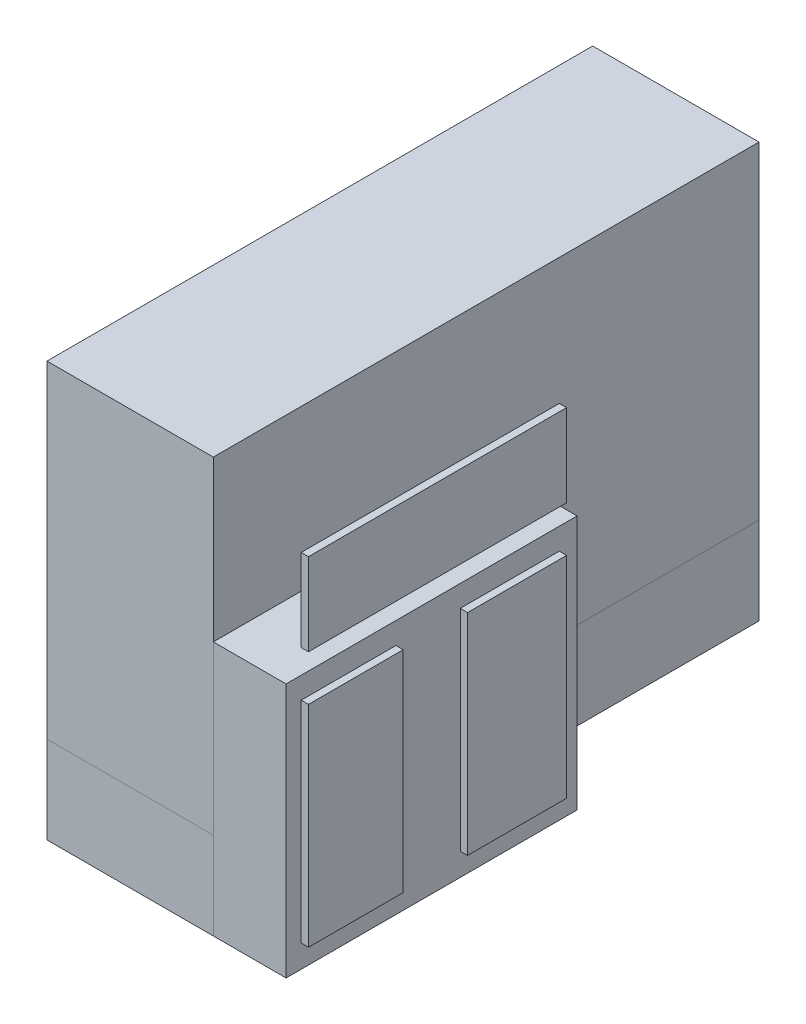
ISO-10303-21;
HEADER;
FILE_DESCRIPTION(('STEP AP214'),'2;1');
FILE_NAME('part.step','',(''),(''),'','','');
FILE_SCHEMA(('AUTOMOTIVE_DESIGN { 1 0 10303 214 1 1 1 1 }'));
ENDSEC;
DATA;
#1=APPLICATION_CONTEXT('core data for automotive mechanical design processes');
#2=APPLICATION_PROTOCOL_DEFINITION('international standard','automotive_design',2000,#1);
#3=PRODUCT_CONTEXT('',#1,'mechanical');
#4=PRODUCT('Part','Part','',(#3));
#5=PRODUCT_RELATED_PRODUCT_CATEGORY('part','',(#4));
#6=PRODUCT_DEFINITION_FORMATION('','',#4);
#7=PRODUCT_DEFINITION_CONTEXT('part definition',#1,'design');
#8=PRODUCT_DEFINITION('design','',#6,#7);
#9=PRODUCT_DEFINITION_SHAPE('','',#8);
#10=(LENGTH_UNIT() NAMED_UNIT(*) SI_UNIT(.MILLI.,.METRE.));
#11=(NAMED_UNIT(*) PLANE_ANGLE_UNIT() SI_UNIT($,.RADIAN.));
#12=(NAMED_UNIT(*) SI_UNIT($,.STERADIAN.) SOLID_ANGLE_UNIT());
#13=UNCERTAINTY_MEASURE_WITH_UNIT(LENGTH_MEASURE(1.E-05),#10,'distance_accuracy_value','');
#14=(GEOMETRIC_REPRESENTATION_CONTEXT(3) GLOBAL_UNCERTAINTY_ASSIGNED_CONTEXT((#13)) GLOBAL_UNIT_ASSIGNED_CONTEXT((#10,
#11,#12)) REPRESENTATION_CONTEXT('',''));
#15=CARTESIAN_POINT('',(0.,0.,0.));
#16=DIRECTION('',(0.,0.,1.));
#17=DIRECTION('',(1.,0.,0.));
#18=AXIS2_PLACEMENT_3D('',#15,#16,#17);
#19=CARTESIAN_POINT('',(338.6,496.114224577136,-20.8248420623599));
#20=DIRECTION('',(0.,0.,-1.));
#21=DIRECTION('',(-1.,0.,0.));
#22=AXIS2_PLACEMENT_3D('',#19,#20,#21);
#23=PLANE('',#22);
#24=DIRECTION('',(0.,-1.,0.));
#25=VECTOR('',#24,1.);
#26=CARTESIAN_POINT('',(328.6,496.114224577136,-20.8248420623599));
#27=LINE('',#26,#25);
#28=CARTESIAN_POINT('',(328.6,496.114224577136,-20.8248420623599));
#29=VERTEX_POINT('',#28);
#30=CARTESIAN_POINT('',(328.6,382.857652333402,-20.8248420623599));
#31=VERTEX_POINT('',#30);
#32=EDGE_CURVE('E109',#29,#31,#27,.T.);
#33=ORIENTED_EDGE('',*,*,#32,.T.);
#34=DIRECTION('',(-1.,0.,0.));
#35=VECTOR('',#34,1.);
#36=CARTESIAN_POINT('',(338.6,382.857652333402,-20.8248420623599));
#37=LINE('',#36,#35);
#38=CARTESIAN_POINT('',(338.6,382.857652333402,-20.8248420623599));
#39=VERTEX_POINT('',#38);
#40=EDGE_CURVE('E12',#39,#31,#37,.T.);
#41=ORIENTED_EDGE('',*,*,#40,.F.);
#42=DIRECTION('',(0.,-1.,0.));
#43=VECTOR('',#42,1.);
#44=CARTESIAN_POINT('',(338.6,496.114224577136,-20.8248420623599));
#45=LINE('',#44,#43);
#46=CARTESIAN_POINT('',(338.6,496.114224577136,-20.8248420623599));
#47=VERTEX_POINT('',#46);
#48=EDGE_CURVE('E97',#47,#39,#45,.T.);
#49=ORIENTED_EDGE('',*,*,#48,.F.);
#50=DIRECTION('',(-1.,0.,0.));
#51=VECTOR('',#50,1.);
#52=CARTESIAN_POINT('',(338.6,496.114224577136,-20.8248420623599));
#53=LINE('',#52,#51);
#54=EDGE_CURVE('E105',#47,#29,#53,.T.);
#55=ORIENTED_EDGE('',*,*,#54,.T.);
#56=EDGE_LOOP('',(#33,#41,#49,#55));
#57=FACE_BOUND('',#56,.T.);
#58=ADVANCED_FACE('F46',(#57),#23,.F.);
#59=CARTESIAN_POINT('',(338.6,382.857652333402,-20.8248420623599));
#60=DIRECTION('',(0.,1.,0.));
#61=DIRECTION('',(0.,0.,1.));
#62=AXIS2_PLACEMENT_3D('',#59,#60,#61);
#63=PLANE('',#62);
#64=DIRECTION('',(0.,0.,-1.));
#65=VECTOR('',#64,1.);
#66=CARTESIAN_POINT('',(328.6,382.857652333402,-20.8248420623599));
#67=LINE('',#66,#65);
#68=CARTESIAN_POINT('',(328.6,382.857652333402,-375.496739351946));
#69=VERTEX_POINT('',#68);
#70=EDGE_CURVE('E101',#31,#69,#67,.T.);
#71=ORIENTED_EDGE('',*,*,#70,.T.);
#72=DIRECTION('',(-1.,0.,0.));
#73=VECTOR('',#72,1.);
#74=CARTESIAN_POINT('',(338.6,382.857652333402,-375.496739351946));
#75=LINE('',#74,#73);
#76=CARTESIAN_POINT('',(338.6,382.857652333402,-375.496739351946));
#77=VERTEX_POINT('',#76);
#78=EDGE_CURVE('E54',#77,#69,#75,.T.);
#79=ORIENTED_EDGE('',*,*,#78,.F.);
#80=DIRECTION('',(0.,0.,-1.));
#81=VECTOR('',#80,1.);
#82=CARTESIAN_POINT('',(338.6,382.857652333402,-20.8248420623599));
#83=LINE('',#82,#81);
#84=EDGE_CURVE('E92',#39,#77,#83,.T.);
#85=ORIENTED_EDGE('',*,*,#84,.F.);
#86=ORIENTED_EDGE('',*,*,#40,.T.);
#87=EDGE_LOOP('',(#71,#79,#85,#86));
#88=FACE_BOUND('',#87,.T.);
#89=ADVANCED_FACE('F100',(#88),#63,.F.);
#90=CARTESIAN_POINT('',(338.6,496.114224577136,-375.496739351946));
#91=DIRECTION('',(0.,0.,1.));
#92=DIRECTION('',(1.,0.,0.));
#93=AXIS2_PLACEMENT_3D('',#90,#91,#92);
#94=PLANE('',#93);
#95=DIRECTION('',(0.,1.,0.));
#96=VECTOR('',#95,1.);
#97=CARTESIAN_POINT('',(328.6,496.114224577136,-375.496739351946));
#98=LINE('',#97,#96);
#99=CARTESIAN_POINT('',(328.6,496.114224577136,-375.496739351946));
#100=VERTEX_POINT('',#99);
#101=EDGE_CURVE('E79',#69,#100,#98,.T.);
#102=ORIENTED_EDGE('',*,*,#101,.T.);
#103=DIRECTION('',(-1.,0.,0.));
#104=VECTOR('',#103,1.);
#105=CARTESIAN_POINT('',(338.6,496.114224577136,-375.496739351946));
#106=LINE('',#105,#104);
#107=CARTESIAN_POINT('',(338.6,496.114224577136,-375.496739351946));
#108=VERTEX_POINT('',#107);
#109=EDGE_CURVE('E102',#108,#100,#106,.T.);
#110=ORIENTED_EDGE('',*,*,#109,.F.);
#111=DIRECTION('',(0.,1.,0.));
#112=VECTOR('',#111,1.);
#113=CARTESIAN_POINT('',(338.6,496.114224577136,-375.496739351946));
#114=LINE('',#113,#112);
#115=EDGE_CURVE('E95',#77,#108,#114,.T.);
#116=ORIENTED_EDGE('',*,*,#115,.F.);
#117=ORIENTED_EDGE('',*,*,#78,.T.);
#118=EDGE_LOOP('',(#102,#110,#116,#117));
#119=FACE_BOUND('',#118,.T.);
#120=ADVANCED_FACE('F103',(#119),#94,.F.);
#121=CARTESIAN_POINT('',(338.6,496.114224577136,-20.8248420623599));
#122=DIRECTION('',(0.,-1.,0.));
#123=DIRECTION('',(0.,0.,-1.));
#124=AXIS2_PLACEMENT_3D('',#121,#122,#123);
#125=PLANE('',#124);
#126=DIRECTION('',(0.,0.,1.));
#127=VECTOR('',#126,1.);
#128=CARTESIAN_POINT('',(328.6,496.114224577136,-20.8248420623599));
#129=LINE('',#128,#127);
#130=EDGE_CURVE('E85',#100,#29,#129,.T.);
#131=ORIENTED_EDGE('',*,*,#130,.T.);
#132=ORIENTED_EDGE('',*,*,#54,.F.);
#133=DIRECTION('',(0.,0.,1.));
#134=VECTOR('',#133,1.);
#135=CARTESIAN_POINT('',(338.6,496.114224577136,-20.8248420623599));
#136=LINE('',#135,#134);
#137=EDGE_CURVE('E62',#108,#47,#136,.T.);
#138=ORIENTED_EDGE('',*,*,#137,.F.);
#139=ORIENTED_EDGE('',*,*,#109,.T.);
#140=EDGE_LOOP('',(#131,#132,#138,#139));
#141=FACE_BOUND('',#140,.T.);
#142=ADVANCED_FACE('F116',(#141),#125,.F.);
#143=CARTESIAN_POINT('',(338.6,0.,0.));
#144=DIRECTION('',(1.,0.,0.));
#145=DIRECTION('',(0.,0.,-1.));
#146=AXIS2_PLACEMENT_3D('',#143,#144,#145);
#147=PLANE('',#146);
#148=ORIENTED_EDGE('',*,*,#48,.T.);
#149=ORIENTED_EDGE('',*,*,#84,.T.);
#150=ORIENTED_EDGE('',*,*,#115,.T.);
#151=ORIENTED_EDGE('',*,*,#137,.T.);
#152=EDGE_LOOP('',(#148,#149,#150,#151));
#153=FACE_BOUND('',#152,.T.);
#154=ADVANCED_FACE('F93',(#153),#147,.T.);
#155=CARTESIAN_POINT('',(328.6,0.,0.));
#156=DIRECTION('',(1.,0.,0.));
#157=DIRECTION('',(0.,0.,-1.));
#158=AXIS2_PLACEMENT_3D('',#155,#156,#157);
#159=PLANE('',#158);
#160=ORIENTED_EDGE('',*,*,#32,.F.);
#161=ORIENTED_EDGE('',*,*,#130,.F.);
#162=ORIENTED_EDGE('',*,*,#101,.F.);
#163=ORIENTED_EDGE('',*,*,#70,.F.);
#164=EDGE_LOOP('',(#160,#161,#162,#163));
#165=FACE_BOUND('',#164,.T.);
#166=ADVANCED_FACE('F119',(#165),#159,.F.);
#167=CLOSED_SHELL('',(#58,#89,#120,#142,#154,#166));
#168=MANIFOLD_SOLID_BREP('B2',#167);
#169=CARTESIAN_POINT('',(328.6,0.,0.));
#170=DIRECTION('',(1.,0.,0.));
#171=DIRECTION('',(0.,0.,-1.));
#172=AXIS2_PLACEMENT_3D('',#169,#170,#171);
#173=PLANE('',#172);
#174=DIRECTION('',(0.,0.,-1.));
#175=VECTOR('',#174,1.);
#176=CARTESIAN_POINT('',(328.6,31.1661911554934,-20.8248420623599));
#177=LINE('',#176,#175);
#178=CARTESIAN_POINT('',(328.6,31.1661911554934,-20.8248420623599));
#179=VERTEX_POINT('',#178);
#180=CARTESIAN_POINT('',(328.6,31.1661911554934,-150.970552272264));
#181=VERTEX_POINT('',#180);
#182=EDGE_CURVE('E325',#179,#181,#177,.T.);
#183=ORIENTED_EDGE('',*,*,#182,.F.);
#184=DIRECTION('',(0.,-1.,0.));
#185=VECTOR('',#184,1.);
#186=CARTESIAN_POINT('',(328.6,320.268493988181,-20.8248420623599));
#187=LINE('',#186,#185);
#188=CARTESIAN_POINT('',(328.6,320.268493988181,-20.8248420623599));
#189=VERTEX_POINT('',#188);
#190=EDGE_CURVE('E311',#189,#179,#187,.T.);
#191=ORIENTED_EDGE('',*,*,#190,.F.);
#192=DIRECTION('',(0.,0.,1.));
#193=VECTOR('',#192,1.);
#194=CARTESIAN_POINT('',(328.6,320.268493988181,-20.8248420623599));
#195=LINE('',#194,#193);
#196=CARTESIAN_POINT('',(328.6,320.268493988181,-150.970552272264));
#197=VERTEX_POINT('',#196);
#198=EDGE_CURVE('E316',#197,#189,#195,.T.);
#199=ORIENTED_EDGE('',*,*,#198,.F.);
#200=DIRECTION('',(0.,1.,0.));
#201=VECTOR('',#200,1.);
#202=CARTESIAN_POINT('',(328.6,320.268493988181,-150.970552272264));
#203=LINE('',#202,#201);
#204=EDGE_CURVE('E327',#181,#197,#203,.T.);
#205=ORIENTED_EDGE('',*,*,#204,.F.);
#206=EDGE_LOOP('',(#183,#191,#199,#205));
#207=FACE_BOUND('',#206,.T.);
#208=DIRECTION('',(0.,-1.,0.));
#209=VECTOR('',#208,1.);
#210=CARTESIAN_POINT('',(328.6,350.,0.));
#211=LINE('',#210,#209);
#212=CARTESIAN_POINT('',(328.6,350.,0.));
#213=VERTEX_POINT('',#212);
#214=CARTESIAN_POINT('',(328.6,0.,0.));
#215=VERTEX_POINT('',#214);
#216=EDGE_CURVE('E339',#213,#215,#211,.T.);
#217=ORIENTED_EDGE('',*,*,#216,.T.);
#218=DIRECTION('',(0.,0.,-1.));
#219=VECTOR('',#218,1.);
#220=CARTESIAN_POINT('',(328.6,0.,0.));
#221=LINE('',#220,#219);
#222=CARTESIAN_POINT('',(328.6,0.,-400.));
#223=VERTEX_POINT('',#222);
#224=EDGE_CURVE('E342',#215,#223,#221,.T.);
#225=ORIENTED_EDGE('',*,*,#224,.T.);
#226=DIRECTION('',(0.,1.,0.));
#227=VECTOR('',#226,1.);
#228=CARTESIAN_POINT('',(328.6,0.,-400.));
#229=LINE('',#228,#227);
#230=CARTESIAN_POINT('',(328.6,350.,-400.));
#231=VERTEX_POINT('',#230);
#232=EDGE_CURVE('E298',#223,#231,#229,.T.);
#233=ORIENTED_EDGE('',*,*,#232,.T.);
#234=DIRECTION('',(0.,0.,1.));
#235=VECTOR('',#234,1.);
#236=CARTESIAN_POINT('',(328.6,350.,0.));
#237=LINE('',#236,#235);
#238=EDGE_CURVE('E345',#231,#213,#237,.T.);
#239=ORIENTED_EDGE('',*,*,#238,.T.);
#240=EDGE_LOOP('',(#217,#225,#233,#239));
#241=FACE_BOUND('',#240,.T.);
#242=DIRECTION('',(0.,0.,-1.));
#243=VECTOR('',#242,1.);
#244=CARTESIAN_POINT('',(328.6,31.1661911554934,-239.390156918688));
#245=LINE('',#244,#243);
#246=CARTESIAN_POINT('',(328.6,31.1661911554934,-239.390156918688));
#247=VERTEX_POINT('',#246);
#248=CARTESIAN_POINT('',(328.6,31.1661911554934,-375.496739351946));
#249=VERTEX_POINT('',#248);
#250=EDGE_CURVE('E496',#247,#249,#245,.T.);
#251=ORIENTED_EDGE('',*,*,#250,.F.);
#252=DIRECTION('',(0.,-1.,0.));
#253=VECTOR('',#252,1.);
#254=CARTESIAN_POINT('',(328.6,320.268493988181,-239.390156918688));
#255=LINE('',#254,#253);
#256=CARTESIAN_POINT('',(328.6,320.268493988181,-239.390156918688));
#257=VERTEX_POINT('',#256);
#258=EDGE_CURVE('E293',#257,#247,#255,.T.);
#259=ORIENTED_EDGE('',*,*,#258,.F.);
#260=DIRECTION('',(0.,0.,1.));
#261=VECTOR('',#260,1.);
#262=CARTESIAN_POINT('',(328.6,320.268493988181,-239.390156918688));
#263=LINE('',#262,#261);
#264=CARTESIAN_POINT('',(328.6,320.268493988181,-375.496739351946));
#265=VERTEX_POINT('',#264);
#266=EDGE_CURVE('E289',#265,#257,#263,.T.);
#267=ORIENTED_EDGE('',*,*,#266,.F.);
#268=DIRECTION('',(0.,1.,0.));
#269=VECTOR('',#268,1.);
#270=CARTESIAN_POINT('',(328.6,320.268493988181,-375.496739351946));
#271=LINE('',#270,#269);
#272=EDGE_CURVE('E493',#249,#265,#271,.T.);
#273=ORIENTED_EDGE('',*,*,#272,.F.);
#274=EDGE_LOOP('',(#251,#259,#267,#273));
#275=FACE_BOUND('',#274,.T.);
#276=ADVANCED_FACE('F180',(#207,#241,#275),#173,.T.);
#277=CARTESIAN_POINT('',(328.6,350.,0.));
#278=DIRECTION('',(0.,0.,-1.));
#279=DIRECTION('',(0.,1.,0.));
#280=AXIS2_PLACEMENT_3D('',#277,#278,#279);
#281=PLANE('',#280);
#282=DIRECTION('',(0.,-1.,0.));
#283=VECTOR('',#282,1.);
#284=CARTESIAN_POINT('',(228.6,350.,0.));
#285=LINE('',#284,#283);
#286=CARTESIAN_POINT('',(228.6,350.,0.));
#287=VERTEX_POINT('',#286);
#288=CARTESIAN_POINT('',(228.6,0.,0.));
#289=VERTEX_POINT('',#288);
#290=EDGE_CURVE('E338',#287,#289,#285,.T.);
#291=ORIENTED_EDGE('',*,*,#290,.T.);
#292=DIRECTION('',(-1.,0.,0.));
#293=VECTOR('',#292,1.);
#294=CARTESIAN_POINT('',(328.6,0.,0.));
#295=LINE('',#294,#293);
#296=EDGE_CURVE('E44',#215,#289,#295,.T.);
#297=ORIENTED_EDGE('',*,*,#296,.F.);
#298=ORIENTED_EDGE('',*,*,#216,.F.);
#299=DIRECTION('',(-1.,0.,0.));
#300=VECTOR('',#299,1.);
#301=CARTESIAN_POINT('',(328.6,350.,0.));
#302=LINE('',#301,#300);
#303=EDGE_CURVE('E188',#213,#287,#302,.T.);
#304=ORIENTED_EDGE('',*,*,#303,.T.);
#305=EDGE_LOOP('',(#291,#297,#298,#304));
#306=FACE_BOUND('',#305,.T.);
#307=ADVANCED_FACE('F182',(#306),#281,.F.);
#308=CARTESIAN_POINT('',(328.6,0.,0.));
#309=DIRECTION('',(0.,1.,0.));
#310=DIRECTION('',(0.,0.,1.));
#311=AXIS2_PLACEMENT_3D('',#308,#309,#310);
#312=PLANE('',#311);
#313=DIRECTION('',(0.,0.,-1.));
#314=VECTOR('',#313,1.);
#315=CARTESIAN_POINT('',(228.6,0.,0.));
#316=LINE('',#315,#314);
#317=CARTESIAN_POINT('',(228.6,0.,-400.));
#318=VERTEX_POINT('',#317);
#319=EDGE_CURVE('E349',#289,#318,#316,.T.);
#320=ORIENTED_EDGE('',*,*,#319,.T.);
#321=DIRECTION('',(-1.,0.,0.));
#322=VECTOR('',#321,1.);
#323=CARTESIAN_POINT('',(328.6,0.,-400.));
#324=LINE('',#323,#322);
#325=EDGE_CURVE('E308',#223,#318,#324,.T.);
#326=ORIENTED_EDGE('',*,*,#325,.F.);
#327=ORIENTED_EDGE('',*,*,#224,.F.);
#328=ORIENTED_EDGE('',*,*,#296,.T.);
#329=EDGE_LOOP('',(#320,#326,#327,#328));
#330=FACE_BOUND('',#329,.T.);
#331=ADVANCED_FACE('F363',(#330),#312,.F.);
#332=CARTESIAN_POINT('',(328.6,350.,0.));
#333=DIRECTION('',(0.,-1.,0.));
#334=DIRECTION('',(0.,0.,-1.));
#335=AXIS2_PLACEMENT_3D('',#332,#333,#334);
#336=PLANE('',#335);
#337=DIRECTION('',(0.,0.,1.));
#338=VECTOR('',#337,1.);
#339=CARTESIAN_POINT('',(228.6,350.,0.));
#340=LINE('',#339,#338);
#341=CARTESIAN_POINT('',(228.6,350.,-400.));
#342=VERTEX_POINT('',#341);
#343=EDGE_CURVE('E343',#342,#287,#340,.T.);
#344=ORIENTED_EDGE('',*,*,#343,.T.);
#345=ORIENTED_EDGE('',*,*,#303,.F.);
#346=ORIENTED_EDGE('',*,*,#238,.F.);
#347=DIRECTION('',(-1.,0.,0.));
#348=VECTOR('',#347,1.);
#349=CARTESIAN_POINT('',(328.6,350.,-400.));
#350=LINE('',#349,#348);
#351=EDGE_CURVE('E304',#231,#342,#350,.T.);
#352=ORIENTED_EDGE('',*,*,#351,.T.);
#353=EDGE_LOOP('',(#344,#345,#346,#352));
#354=FACE_BOUND('',#353,.T.);
#355=ADVANCED_FACE('F368',(#354),#336,.F.);
#356=CARTESIAN_POINT('',(228.6,0.,0.));
#357=DIRECTION('',(1.,0.,0.));
#358=DIRECTION('',(0.,0.,-1.));
#359=AXIS2_PLACEMENT_3D('',#356,#357,#358);
#360=PLANE('',#359);
#361=ORIENTED_EDGE('',*,*,#290,.F.);
#362=ORIENTED_EDGE('',*,*,#343,.F.);
#363=DIRECTION('',(0.,1.,0.));
#364=VECTOR('',#363,1.);
#365=CARTESIAN_POINT('',(228.6,0.,-400.));
#366=LINE('',#365,#364);
#367=EDGE_CURVE('E295',#318,#342,#366,.T.);
#368=ORIENTED_EDGE('',*,*,#367,.F.);
#369=ORIENTED_EDGE('',*,*,#319,.F.);
#370=EDGE_LOOP('',(#361,#362,#368,#369));
#371=FACE_BOUND('',#370,.T.);
#372=ADVANCED_FACE('F359',(#371),#360,.F.);
#373=CARTESIAN_POINT('',(338.6,320.268493988181,-20.8248420623599));
#374=DIRECTION('',(0.,0.,-1.));
#375=DIRECTION('',(-1.,0.,0.));
#376=AXIS2_PLACEMENT_3D('',#373,#374,#375);
#377=PLANE('',#376);
#378=ORIENTED_EDGE('',*,*,#190,.T.);
#379=DIRECTION('',(-1.,0.,0.));
#380=VECTOR('',#379,1.);
#381=CARTESIAN_POINT('',(338.6,31.1661911554934,-20.8248420623599));
#382=LINE('',#381,#380);
#383=CARTESIAN_POINT('',(338.6,31.1661911554934,-20.8248420623599));
#384=VERTEX_POINT('',#383);
#385=EDGE_CURVE('E336',#384,#179,#382,.T.);
#386=ORIENTED_EDGE('',*,*,#385,.F.);
#387=DIRECTION('',(0.,-1.,0.));
#388=VECTOR('',#387,1.);
#389=CARTESIAN_POINT('',(338.6,320.268493988181,-20.8248420623599));
#390=LINE('',#389,#388);
#391=CARTESIAN_POINT('',(338.6,320.268493988181,-20.8248420623599));
#392=VERTEX_POINT('',#391);
#393=EDGE_CURVE('E312',#392,#384,#390,.T.);
#394=ORIENTED_EDGE('',*,*,#393,.F.);
#395=DIRECTION('',(-1.,0.,0.));
#396=VECTOR('',#395,1.);
#397=CARTESIAN_POINT('',(338.6,320.268493988181,-20.8248420623599));
#398=LINE('',#397,#396);
#399=EDGE_CURVE('E322',#392,#189,#398,.T.);
#400=ORIENTED_EDGE('',*,*,#399,.T.);
#401=EDGE_LOOP('',(#378,#386,#394,#400));
#402=FACE_BOUND('',#401,.T.);
#403=ADVANCED_FACE('F391',(#402),#377,.F.);
#404=CARTESIAN_POINT('',(338.6,31.1661911554934,-20.8248420623599));
#405=DIRECTION('',(0.,1.,0.));
#406=DIRECTION('',(0.,0.,1.));
#407=AXIS2_PLACEMENT_3D('',#404,#405,#406);
#408=PLANE('',#407);
#409=ORIENTED_EDGE('',*,*,#182,.T.);
#410=DIRECTION('',(-1.,0.,0.));
#411=VECTOR('',#410,1.);
#412=CARTESIAN_POINT('',(338.6,31.1661911554934,-150.970552272264));
#413=LINE('',#412,#411);
#414=CARTESIAN_POINT('',(338.6,31.1661911554934,-150.970552272264));
#415=VERTEX_POINT('',#414);
#416=EDGE_CURVE('E333',#415,#181,#413,.T.);
#417=ORIENTED_EDGE('',*,*,#416,.F.);
#418=DIRECTION('',(0.,0.,-1.));
#419=VECTOR('',#418,1.);
#420=CARTESIAN_POINT('',(338.6,31.1661911554934,-20.8248420623599));
#421=LINE('',#420,#419);
#422=EDGE_CURVE('E315',#384,#415,#421,.T.);
#423=ORIENTED_EDGE('',*,*,#422,.F.);
#424=ORIENTED_EDGE('',*,*,#385,.T.);
#425=EDGE_LOOP('',(#409,#417,#423,#424));
#426=FACE_BOUND('',#425,.T.);
#427=ADVANCED_FACE('F415',(#426),#408,.F.);
#428=CARTESIAN_POINT('',(338.6,320.268493988181,-150.970552272264));
#429=DIRECTION('',(0.,0.,1.));
#430=DIRECTION('',(1.,0.,0.));
#431=AXIS2_PLACEMENT_3D('',#428,#429,#430);
#432=PLANE('',#431);
#433=ORIENTED_EDGE('',*,*,#204,.T.);
#434=DIRECTION('',(-1.,0.,0.));
#435=VECTOR('',#434,1.);
#436=CARTESIAN_POINT('',(338.6,320.268493988181,-150.970552272264));
#437=LINE('',#436,#435);
#438=CARTESIAN_POINT('',(338.6,320.268493988181,-150.970552272264));
#439=VERTEX_POINT('',#438);
#440=EDGE_CURVE('E203',#439,#197,#437,.T.);
#441=ORIENTED_EDGE('',*,*,#440,.F.);
#442=DIRECTION('',(0.,1.,0.));
#443=VECTOR('',#442,1.);
#444=CARTESIAN_POINT('',(338.6,320.268493988181,-150.970552272264));
#445=LINE('',#444,#443);
#446=EDGE_CURVE('E318',#415,#439,#445,.T.);
#447=ORIENTED_EDGE('',*,*,#446,.F.);
#448=ORIENTED_EDGE('',*,*,#416,.T.);
#449=EDGE_LOOP('',(#433,#441,#447,#448));
#450=FACE_BOUND('',#449,.T.);
#451=ADVANCED_FACE('F422',(#450),#432,.F.);
#452=CARTESIAN_POINT('',(338.6,320.268493988181,-20.8248420623599));
#453=DIRECTION('',(0.,-1.,0.));
#454=DIRECTION('',(0.,0.,-1.));
#455=AXIS2_PLACEMENT_3D('',#452,#453,#454);
#456=PLANE('',#455);
#457=ORIENTED_EDGE('',*,*,#198,.T.);
#458=ORIENTED_EDGE('',*,*,#399,.F.);
#459=DIRECTION('',(0.,0.,1.));
#460=VECTOR('',#459,1.);
#461=CARTESIAN_POINT('',(338.6,320.268493988181,-20.8248420623599));
#462=LINE('',#461,#460);
#463=EDGE_CURVE('E320',#439,#392,#462,.T.);
#464=ORIENTED_EDGE('',*,*,#463,.F.);
#465=ORIENTED_EDGE('',*,*,#440,.T.);
#466=EDGE_LOOP('',(#457,#458,#464,#465));
#467=FACE_BOUND('',#466,.T.);
#468=ADVANCED_FACE('F379',(#467),#456,.F.);
#469=CARTESIAN_POINT('',(338.6,0.,0.));
#470=DIRECTION('',(1.,0.,0.));
#471=DIRECTION('',(0.,0.,-1.));
#472=AXIS2_PLACEMENT_3D('',#469,#470,#471);
#473=PLANE('',#472);
#474=ORIENTED_EDGE('',*,*,#393,.T.);
#475=ORIENTED_EDGE('',*,*,#422,.T.);
#476=ORIENTED_EDGE('',*,*,#446,.T.);
#477=ORIENTED_EDGE('',*,*,#463,.T.);
#478=EDGE_LOOP('',(#474,#475,#476,#477));
#479=FACE_BOUND('',#478,.T.);
#480=ADVANCED_FACE('F372',(#479),#473,.T.);
#481=CARTESIAN_POINT('',(328.6,0.,-400.));
#482=DIRECTION('',(0.,0.,1.));
#483=DIRECTION('',(1.,0.,0.));
#484=AXIS2_PLACEMENT_3D('',#481,#482,#483);
#485=PLANE('',#484);
#486=ORIENTED_EDGE('',*,*,#367,.T.);
#487=ORIENTED_EDGE('',*,*,#351,.F.);
#488=ORIENTED_EDGE('',*,*,#232,.F.);
#489=ORIENTED_EDGE('',*,*,#325,.T.);
#490=EDGE_LOOP('',(#486,#487,#488,#489));
#491=FACE_BOUND('',#490,.T.);
#492=ADVANCED_FACE('F370',(#491),#485,.F.);
#493=CARTESIAN_POINT('',(338.6,320.268493988181,-239.390156918688));
#494=DIRECTION('',(0.,0.,-1.));
#495=DIRECTION('',(-1.,0.,0.));
#496=AXIS2_PLACEMENT_3D('',#493,#494,#495);
#497=PLANE('',#496);
#498=ORIENTED_EDGE('',*,*,#258,.T.);
#499=DIRECTION('',(-1.,0.,0.));
#500=VECTOR('',#499,1.);
#501=CARTESIAN_POINT('',(338.6,31.1661911554934,-239.390156918688));
#502=LINE('',#501,#500);
#503=CARTESIAN_POINT('',(338.6,31.1661911554934,-239.390156918688));
#504=VERTEX_POINT('',#503);
#505=EDGE_CURVE('E274',#504,#247,#502,.T.);
#506=ORIENTED_EDGE('',*,*,#505,.F.);
#507=DIRECTION('',(0.,-1.,0.));
#508=VECTOR('',#507,1.);
#509=CARTESIAN_POINT('',(338.6,320.268493988181,-239.390156918688));
#510=LINE('',#509,#508);
#511=CARTESIAN_POINT('',(338.6,320.268493988181,-239.390156918688));
#512=VERTEX_POINT('',#511);
#513=EDGE_CURVE('E281',#512,#504,#510,.T.);
#514=ORIENTED_EDGE('',*,*,#513,.F.);
#515=DIRECTION('',(-1.,0.,0.));
#516=VECTOR('',#515,1.);
#517=CARTESIAN_POINT('',(338.6,320.268493988181,-239.390156918688));
#518=LINE('',#517,#516);
#519=EDGE_CURVE('E491',#512,#257,#518,.T.);
#520=ORIENTED_EDGE('',*,*,#519,.T.);
#521=EDGE_LOOP('',(#498,#506,#514,#520));
#522=FACE_BOUND('',#521,.T.);
#523=ADVANCED_FACE('F291',(#522),#497,.F.);
#524=CARTESIAN_POINT('',(338.6,31.1661911554934,-239.390156918688));
#525=DIRECTION('',(0.,1.,0.));
#526=DIRECTION('',(0.,0.,1.));
#527=AXIS2_PLACEMENT_3D('',#524,#525,#526);
#528=PLANE('',#527);
#529=ORIENTED_EDGE('',*,*,#250,.T.);
#530=DIRECTION('',(-1.,0.,0.));
#531=VECTOR('',#530,1.);
#532=CARTESIAN_POINT('',(338.6,31.1661911554934,-375.496739351946));
#533=LINE('',#532,#531);
#534=CARTESIAN_POINT('',(338.6,31.1661911554934,-375.496739351946));
#535=VERTEX_POINT('',#534);
#536=EDGE_CURVE('E277',#535,#249,#533,.T.);
#537=ORIENTED_EDGE('',*,*,#536,.F.);
#538=DIRECTION('',(0.,0.,-1.));
#539=VECTOR('',#538,1.);
#540=CARTESIAN_POINT('',(338.6,31.1661911554934,-239.390156918688));
#541=LINE('',#540,#539);
#542=EDGE_CURVE('E270',#504,#535,#541,.T.);
#543=ORIENTED_EDGE('',*,*,#542,.F.);
#544=ORIENTED_EDGE('',*,*,#505,.T.);
#545=EDGE_LOOP('',(#529,#537,#543,#544));
#546=FACE_BOUND('',#545,.T.);
#547=ADVANCED_FACE('F272',(#546),#528,.F.);
#548=CARTESIAN_POINT('',(338.6,320.268493988181,-375.496739351946));
#549=DIRECTION('',(0.,0.,1.));
#550=DIRECTION('',(1.,0.,0.));
#551=AXIS2_PLACEMENT_3D('',#548,#549,#550);
#552=PLANE('',#551);
#553=ORIENTED_EDGE('',*,*,#272,.T.);
#554=DIRECTION('',(-1.,0.,0.));
#555=VECTOR('',#554,1.);
#556=CARTESIAN_POINT('',(338.6,320.268493988181,-375.496739351946));
#557=LINE('',#556,#555);
#558=CARTESIAN_POINT('',(338.6,320.268493988181,-375.496739351946));
#559=VERTEX_POINT('',#558);
#560=EDGE_CURVE('E195',#559,#265,#557,.T.);
#561=ORIENTED_EDGE('',*,*,#560,.F.);
#562=DIRECTION('',(0.,1.,0.));
#563=VECTOR('',#562,1.);
#564=CARTESIAN_POINT('',(338.6,320.268493988181,-375.496739351946));
#565=LINE('',#564,#563);
#566=EDGE_CURVE('E280',#535,#559,#565,.T.);
#567=ORIENTED_EDGE('',*,*,#566,.F.);
#568=ORIENTED_EDGE('',*,*,#536,.T.);
#569=EDGE_LOOP('',(#553,#561,#567,#568));
#570=FACE_BOUND('',#569,.T.);
#571=ADVANCED_FACE('F460',(#570),#552,.F.);
#572=CARTESIAN_POINT('',(338.6,320.268493988181,-239.390156918688));
#573=DIRECTION('',(0.,-1.,0.));
#574=DIRECTION('',(0.,0.,-1.));
#575=AXIS2_PLACEMENT_3D('',#572,#573,#574);
#576=PLANE('',#575);
#577=ORIENTED_EDGE('',*,*,#266,.T.);
#578=ORIENTED_EDGE('',*,*,#519,.F.);
#579=DIRECTION('',(0.,0.,1.));
#580=VECTOR('',#579,1.);
#581=CARTESIAN_POINT('',(338.6,320.268493988181,-239.390156918688));
#582=LINE('',#581,#580);
#583=EDGE_CURVE('E285',#559,#512,#582,.T.);
#584=ORIENTED_EDGE('',*,*,#583,.F.);
#585=ORIENTED_EDGE('',*,*,#560,.T.);
#586=EDGE_LOOP('',(#577,#578,#584,#585));
#587=FACE_BOUND('',#586,.T.);
#588=ADVANCED_FACE('F469',(#587),#576,.F.);
#589=CARTESIAN_POINT('',(338.6,0.,0.));
#590=DIRECTION('',(1.,0.,0.));
#591=DIRECTION('',(0.,0.,-1.));
#592=AXIS2_PLACEMENT_3D('',#589,#590,#591);
#593=PLANE('',#592);
#594=ORIENTED_EDGE('',*,*,#513,.T.);
#595=ORIENTED_EDGE('',*,*,#542,.T.);
#596=ORIENTED_EDGE('',*,*,#566,.T.);
#597=ORIENTED_EDGE('',*,*,#583,.T.);
#598=EDGE_LOOP('',(#594,#595,#596,#597));
#599=FACE_BOUND('',#598,.T.);
#600=ADVANCED_FACE('F284',(#599),#593,.T.);
#601=CLOSED_SHELL('',(#276,#307,#331,#355,#372,#403,#427,#451,#468,#480,#492,#523,#547,#571,
#588,#600));
#602=MANIFOLD_SOLID_BREP('B6',#601);
#603=CARTESIAN_POINT('',(0.,570.,0.));
#604=DIRECTION('',(1.,0.,0.));
#605=DIRECTION('',(0.,0.,-1.));
#606=AXIS2_PLACEMENT_3D('',#603,#604,#605);
#607=PLANE('',#606);
#608=DIRECTION('',(0.,0.,1.));
#609=VECTOR('',#608,1.);
#610=CARTESIAN_POINT('',(0.,120.,0.));
#611=LINE('',#610,#609);
#612=CARTESIAN_POINT('',(0.,120.,-750.));
#613=VERTEX_POINT('',#612);
#614=CARTESIAN_POINT('',(0.,120.,0.));
#615=VERTEX_POINT('',#614);
#616=EDGE_CURVE('E618',#613,#615,#611,.T.);
#617=ORIENTED_EDGE('',*,*,#616,.T.);
#618=DIRECTION('',(0.,-1.,0.));
#619=VECTOR('',#618,1.);
#620=CARTESIAN_POINT('',(0.,570.,0.));
#621=LINE('',#620,#619);
#622=CARTESIAN_POINT('',(0.,570.,0.));
#623=VERTEX_POINT('',#622);
#624=EDGE_CURVE('E178',#623,#615,#621,.T.);
#625=ORIENTED_EDGE('',*,*,#624,.F.);
#626=DIRECTION('',(0.,0.,1.));
#627=VECTOR('',#626,1.);
#628=CARTESIAN_POINT('',(0.,570.,0.));
#629=LINE('',#628,#627);
#630=CARTESIAN_POINT('',(0.,570.,-750.));
#631=VERTEX_POINT('',#630);
#632=EDGE_CURVE('E606',#631,#623,#629,.T.);
#633=ORIENTED_EDGE('',*,*,#632,.F.);
#634=DIRECTION('',(0.,-1.,0.));
#635=VECTOR('',#634,1.);
#636=CARTESIAN_POINT('',(0.,570.,-750.));
#637=LINE('',#636,#635);
#638=EDGE_CURVE('E614',#631,#613,#637,.T.);
#639=ORIENTED_EDGE('',*,*,#638,.T.);
#640=EDGE_LOOP('',(#617,#625,#633,#639));
#641=FACE_BOUND('',#640,.T.);
#642=ADVANCED_FACE('F555',(#641),#607,.F.);
#643=CARTESIAN_POINT('',(0.,570.,0.));
#644=DIRECTION('',(0.,0.,-1.));
#645=DIRECTION('',(-1.,0.,0.));
#646=AXIS2_PLACEMENT_3D('',#643,#644,#645);
#647=PLANE('',#646);
#648=DIRECTION('',(1.,0.,0.));
#649=VECTOR('',#648,1.);
#650=CARTESIAN_POINT('',(0.,120.,0.));
#651=LINE('',#650,#649);
#652=CARTESIAN_POINT('',(228.6,120.,0.));
#653=VERTEX_POINT('',#652);
#654=EDGE_CURVE('E610',#615,#653,#651,.T.);
#655=ORIENTED_EDGE('',*,*,#654,.T.);
#656=DIRECTION('',(0.,-1.,0.));
#657=VECTOR('',#656,1.);
#658=CARTESIAN_POINT('',(228.6,570.,0.));
#659=LINE('',#658,#657);
#660=CARTESIAN_POINT('',(228.6,570.,0.));
#661=VERTEX_POINT('',#660);
#662=EDGE_CURVE('E563',#661,#653,#659,.T.);
#663=ORIENTED_EDGE('',*,*,#662,.F.);
#664=DIRECTION('',(1.,0.,0.));
#665=VECTOR('',#664,1.);
#666=CARTESIAN_POINT('',(0.,570.,0.));
#667=LINE('',#666,#665);
#668=EDGE_CURVE('E601',#623,#661,#667,.T.);
#669=ORIENTED_EDGE('',*,*,#668,.F.);
#670=ORIENTED_EDGE('',*,*,#624,.T.);
#671=EDGE_LOOP('',(#655,#663,#669,#670));
#672=FACE_BOUND('',#671,.T.);
#673=ADVANCED_FACE('F609',(#672),#647,.F.);
#674=CARTESIAN_POINT('',(228.6,570.,0.));
#675=DIRECTION('',(-1.,0.,0.));
#676=DIRECTION('',(0.,0.,1.));
#677=AXIS2_PLACEMENT_3D('',#674,#675,#676);
#678=PLANE('',#677);
#679=DIRECTION('',(0.,0.,-1.));
#680=VECTOR('',#679,1.);
#681=CARTESIAN_POINT('',(228.6,120.,0.));
#682=LINE('',#681,#680);
#683=CARTESIAN_POINT('',(228.6,120.,-750.));
#684=VERTEX_POINT('',#683);
#685=EDGE_CURVE('E588',#653,#684,#682,.T.);
#686=ORIENTED_EDGE('',*,*,#685,.T.);
#687=DIRECTION('',(0.,-1.,0.));
#688=VECTOR('',#687,1.);
#689=CARTESIAN_POINT('',(228.6,570.,-750.));
#690=LINE('',#689,#688);
#691=CARTESIAN_POINT('',(228.6,570.,-750.));
#692=VERTEX_POINT('',#691);
#693=EDGE_CURVE('E611',#692,#684,#690,.T.);
#694=ORIENTED_EDGE('',*,*,#693,.F.);
#695=DIRECTION('',(0.,0.,-1.));
#696=VECTOR('',#695,1.);
#697=CARTESIAN_POINT('',(228.6,570.,0.));
#698=LINE('',#697,#696);
#699=EDGE_CURVE('E604',#661,#692,#698,.T.);
#700=ORIENTED_EDGE('',*,*,#699,.F.);
#701=ORIENTED_EDGE('',*,*,#662,.T.);
#702=EDGE_LOOP('',(#686,#694,#700,#701));
#703=FACE_BOUND('',#702,.T.);
#704=ADVANCED_FACE('F612',(#703),#678,.F.);
#705=CARTESIAN_POINT('',(0.,570.,-750.));
#706=DIRECTION('',(0.,0.,1.));
#707=DIRECTION('',(1.,0.,0.));
#708=AXIS2_PLACEMENT_3D('',#705,#706,#707);
#709=PLANE('',#708);
#710=DIRECTION('',(-1.,0.,0.));
#711=VECTOR('',#710,1.);
#712=CARTESIAN_POINT('',(0.,120.,-750.));
#713=LINE('',#712,#711);
#714=EDGE_CURVE('E594',#684,#613,#713,.T.);
#715=ORIENTED_EDGE('',*,*,#714,.T.);
#716=ORIENTED_EDGE('',*,*,#638,.F.);
#717=DIRECTION('',(-1.,0.,0.));
#718=VECTOR('',#717,1.);
#719=CARTESIAN_POINT('',(0.,570.,-750.));
#720=LINE('',#719,#718);
#721=EDGE_CURVE('E571',#692,#631,#720,.T.);
#722=ORIENTED_EDGE('',*,*,#721,.F.);
#723=ORIENTED_EDGE('',*,*,#693,.T.);
#724=EDGE_LOOP('',(#715,#716,#722,#723));
#725=FACE_BOUND('',#724,.T.);
#726=ADVANCED_FACE('F625',(#725),#709,.F.);
#727=CARTESIAN_POINT('',(0.,570.,0.));
#728=DIRECTION('',(0.,-1.,0.));
#729=DIRECTION('',(0.,0.,-1.));
#730=AXIS2_PLACEMENT_3D('',#727,#728,#729);
#731=PLANE('',#730);
#732=ORIENTED_EDGE('',*,*,#632,.T.);
#733=ORIENTED_EDGE('',*,*,#668,.T.);
#734=ORIENTED_EDGE('',*,*,#699,.T.);
#735=ORIENTED_EDGE('',*,*,#721,.T.);
#736=EDGE_LOOP('',(#732,#733,#734,#735));
#737=FACE_BOUND('',#736,.T.);
#738=ADVANCED_FACE('F602',(#737),#731,.F.);
#739=CARTESIAN_POINT('',(0.,120.,0.));
#740=DIRECTION('',(0.,-1.,0.));
#741=DIRECTION('',(0.,0.,-1.));
#742=AXIS2_PLACEMENT_3D('',#739,#740,#741);
#743=PLANE('',#742);
#744=ORIENTED_EDGE('',*,*,#616,.F.);
#745=ORIENTED_EDGE('',*,*,#714,.F.);
#746=ORIENTED_EDGE('',*,*,#685,.F.);
#747=ORIENTED_EDGE('',*,*,#654,.F.);
#748=EDGE_LOOP('',(#744,#745,#746,#747));
#749=FACE_BOUND('',#748,.T.);
#750=ADVANCED_FACE('F628',(#749),#743,.T.);
#751=CLOSED_SHELL('',(#642,#673,#704,#726,#738,#750));
#752=MANIFOLD_SOLID_BREP('B38',#751);
#753=CARTESIAN_POINT('',(0.,120.,0.));
#754=DIRECTION('',(1.,0.,0.));
#755=DIRECTION('',(0.,0.,-1.));
#756=AXIS2_PLACEMENT_3D('',#753,#754,#755);
#757=PLANE('',#756);
#758=DIRECTION('',(0.,0.,1.));
#759=VECTOR('',#758,1.);
#760=CARTESIAN_POINT('',(0.,0.,0.));
#761=LINE('',#760,#759);
#762=CARTESIAN_POINT('',(0.,0.,-750.));
#763=VERTEX_POINT('',#762);
#764=CARTESIAN_POINT('',(0.,0.,0.));
#765=VERTEX_POINT('',#764);
#766=EDGE_CURVE('E742',#763,#765,#761,.T.);
#767=ORIENTED_EDGE('',*,*,#766,.T.);
#768=DIRECTION('',(0.,-1.,0.));
#769=VECTOR('',#768,1.);
#770=CARTESIAN_POINT('',(0.,120.,0.));
#771=LINE('',#770,#769);
#772=CARTESIAN_POINT('',(0.,120.,0.));
#773=VERTEX_POINT('',#772);
#774=EDGE_CURVE('E553',#773,#765,#771,.T.);
#775=ORIENTED_EDGE('',*,*,#774,.F.);
#776=DIRECTION('',(0.,0.,1.));
#777=VECTOR('',#776,1.);
#778=CARTESIAN_POINT('',(0.,120.,0.));
#779=LINE('',#778,#777);
#780=CARTESIAN_POINT('',(0.,120.,-750.));
#781=VERTEX_POINT('',#780);
#782=EDGE_CURVE('E730',#781,#773,#779,.T.);
#783=ORIENTED_EDGE('',*,*,#782,.F.);
#784=DIRECTION('',(0.,-1.,0.));
#785=VECTOR('',#784,1.);
#786=CARTESIAN_POINT('',(0.,120.,-750.));
#787=LINE('',#786,#785);
#788=EDGE_CURVE('E738',#781,#763,#787,.T.);
#789=ORIENTED_EDGE('',*,*,#788,.T.);
#790=EDGE_LOOP('',(#767,#775,#783,#789));
#791=FACE_BOUND('',#790,.T.);
#792=ADVANCED_FACE('F679',(#791),#757,.F.);
#793=CARTESIAN_POINT('',(0.,120.,0.));
#794=DIRECTION('',(0.,0.,-1.));
#795=DIRECTION('',(-1.,0.,0.));
#796=AXIS2_PLACEMENT_3D('',#793,#794,#795);
#797=PLANE('',#796);
#798=DIRECTION('',(1.,0.,0.));
#799=VECTOR('',#798,1.);
#800=CARTESIAN_POINT('',(0.,0.,0.));
#801=LINE('',#800,#799);
#802=CARTESIAN_POINT('',(228.6,0.,0.));
#803=VERTEX_POINT('',#802);
#804=EDGE_CURVE('E734',#765,#803,#801,.T.);
#805=ORIENTED_EDGE('',*,*,#804,.T.);
#806=DIRECTION('',(0.,-1.,0.));
#807=VECTOR('',#806,1.);
#808=CARTESIAN_POINT('',(228.6,120.,0.));
#809=LINE('',#808,#807);
#810=CARTESIAN_POINT('',(228.6,120.,0.));
#811=VERTEX_POINT('',#810);
#812=EDGE_CURVE('E687',#811,#803,#809,.T.);
#813=ORIENTED_EDGE('',*,*,#812,.F.);
#814=DIRECTION('',(1.,0.,0.));
#815=VECTOR('',#814,1.);
#816=CARTESIAN_POINT('',(0.,120.,0.));
#817=LINE('',#816,#815);
#818=EDGE_CURVE('E725',#773,#811,#817,.T.);
#819=ORIENTED_EDGE('',*,*,#818,.F.);
#820=ORIENTED_EDGE('',*,*,#774,.T.);
#821=EDGE_LOOP('',(#805,#813,#819,#820));
#822=FACE_BOUND('',#821,.T.);
#823=ADVANCED_FACE('F733',(#822),#797,.F.);
#824=CARTESIAN_POINT('',(228.6,120.,0.));
#825=DIRECTION('',(-1.,0.,0.));
#826=DIRECTION('',(0.,0.,1.));
#827=AXIS2_PLACEMENT_3D('',#824,#825,#826);
#828=PLANE('',#827);
#829=DIRECTION('',(0.,0.,-1.));
#830=VECTOR('',#829,1.);
#831=CARTESIAN_POINT('',(228.6,0.,0.));
#832=LINE('',#831,#830);
#833=CARTESIAN_POINT('',(228.6,0.,-750.));
#834=VERTEX_POINT('',#833);
#835=EDGE_CURVE('E712',#803,#834,#832,.T.);
#836=ORIENTED_EDGE('',*,*,#835,.T.);
#837=DIRECTION('',(0.,-1.,0.));
#838=VECTOR('',#837,1.);
#839=CARTESIAN_POINT('',(228.6,120.,-750.));
#840=LINE('',#839,#838);
#841=CARTESIAN_POINT('',(228.6,120.,-750.));
#842=VERTEX_POINT('',#841);
#843=EDGE_CURVE('E735',#842,#834,#840,.T.);
#844=ORIENTED_EDGE('',*,*,#843,.F.);
#845=DIRECTION('',(0.,0.,-1.));
#846=VECTOR('',#845,1.);
#847=CARTESIAN_POINT('',(228.6,120.,0.));
#848=LINE('',#847,#846);
#849=EDGE_CURVE('E728',#811,#842,#848,.T.);
#850=ORIENTED_EDGE('',*,*,#849,.F.);
#851=ORIENTED_EDGE('',*,*,#812,.T.);
#852=EDGE_LOOP('',(#836,#844,#850,#851));
#853=FACE_BOUND('',#852,.T.);
#854=ADVANCED_FACE('F736',(#853),#828,.F.);
#855=CARTESIAN_POINT('',(0.,120.,-750.));
#856=DIRECTION('',(0.,0.,1.));
#857=DIRECTION('',(1.,0.,0.));
#858=AXIS2_PLACEMENT_3D('',#855,#856,#857);
#859=PLANE('',#858);
#860=DIRECTION('',(-1.,0.,0.));
#861=VECTOR('',#860,1.);
#862=CARTESIAN_POINT('',(0.,0.,-750.));
#863=LINE('',#862,#861);
#864=EDGE_CURVE('E718',#834,#763,#863,.T.);
#865=ORIENTED_EDGE('',*,*,#864,.T.);
#866=ORIENTED_EDGE('',*,*,#788,.F.);
#867=DIRECTION('',(-1.,0.,0.));
#868=VECTOR('',#867,1.);
#869=CARTESIAN_POINT('',(0.,120.,-750.));
#870=LINE('',#869,#868);
#871=EDGE_CURVE('E695',#842,#781,#870,.T.);
#872=ORIENTED_EDGE('',*,*,#871,.F.);
#873=ORIENTED_EDGE('',*,*,#843,.T.);
#874=EDGE_LOOP('',(#865,#866,#872,#873));
#875=FACE_BOUND('',#874,.T.);
#876=ADVANCED_FACE('F749',(#875),#859,.F.);
#877=CARTESIAN_POINT('',(0.,120.,0.));
#878=DIRECTION('',(0.,-1.,0.));
#879=DIRECTION('',(0.,0.,-1.));
#880=AXIS2_PLACEMENT_3D('',#877,#878,#879);
#881=PLANE('',#880);
#882=ORIENTED_EDGE('',*,*,#782,.T.);
#883=ORIENTED_EDGE('',*,*,#818,.T.);
#884=ORIENTED_EDGE('',*,*,#849,.T.);
#885=ORIENTED_EDGE('',*,*,#871,.T.);
#886=EDGE_LOOP('',(#882,#883,#884,#885));
#887=FACE_BOUND('',#886,.T.);
#888=ADVANCED_FACE('F726',(#887),#881,.F.);
#889=CARTESIAN_POINT('',(0.,0.,0.));
#890=DIRECTION('',(0.,-1.,0.));
#891=DIRECTION('',(0.,0.,-1.));
#892=AXIS2_PLACEMENT_3D('',#889,#890,#891);
#893=PLANE('',#892);
#894=ORIENTED_EDGE('',*,*,#766,.F.);
#895=ORIENTED_EDGE('',*,*,#864,.F.);
#896=ORIENTED_EDGE('',*,*,#835,.F.);
#897=ORIENTED_EDGE('',*,*,#804,.F.);
#898=EDGE_LOOP('',(#894,#895,#896,#897));
#899=FACE_BOUND('',#898,.T.);
#900=ADVANCED_FACE('F752',(#899),#893,.T.);
#901=CLOSED_SHELL('',(#792,#823,#854,#876,#888,#900));
#902=MANIFOLD_SOLID_BREP('B172',#901);
#903=ADVANCED_BREP_SHAPE_REPRESENTATION('',(#18,#168,#602,#752,#902),#14);
#904=SHAPE_DEFINITION_REPRESENTATION(#9,#903);
ENDSEC;
END-ISO-10303-21;
